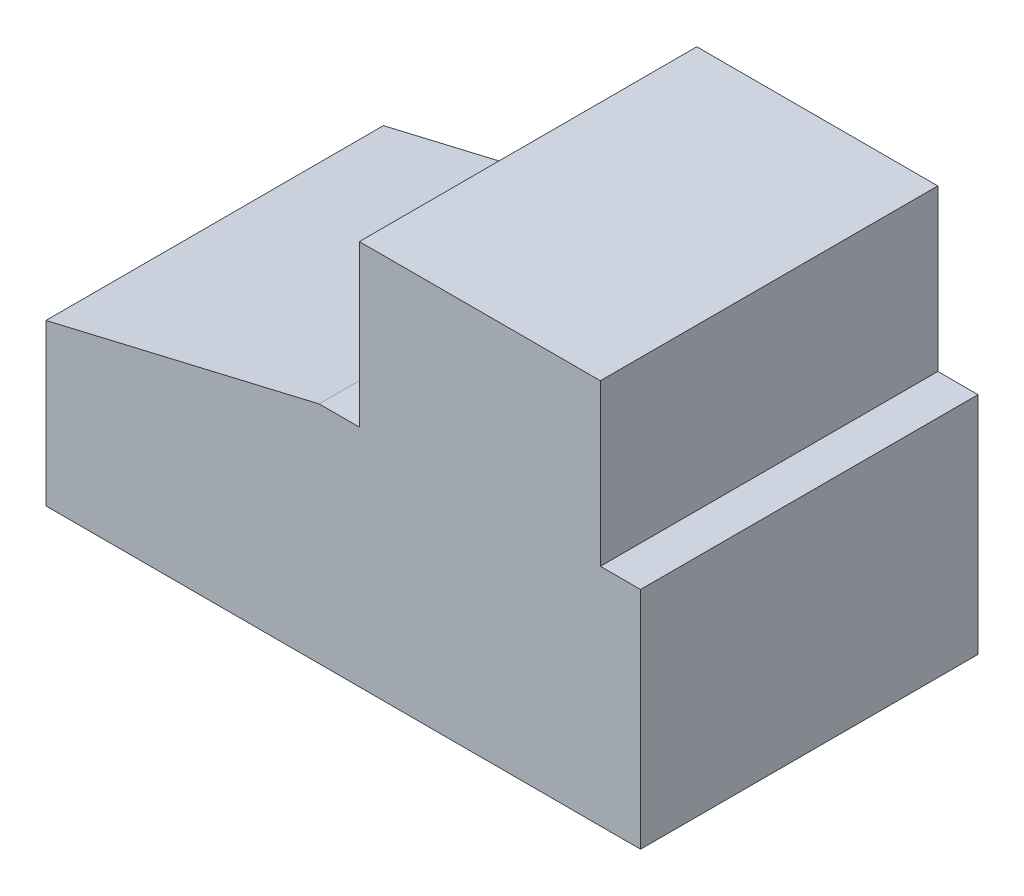
ISO-10303-21;
HEADER;
FILE_DESCRIPTION(('STEP AP214'),'2;1');
FILE_NAME('part.step','',(''),(''),'','','');
FILE_SCHEMA(('AUTOMOTIVE_DESIGN { 1 0 10303 214 1 1 1 1 }'));
ENDSEC;
DATA;
#1=APPLICATION_CONTEXT('core data for automotive mechanical design processes');
#2=APPLICATION_PROTOCOL_DEFINITION('international standard','automotive_design',2000,#1);
#3=PRODUCT_CONTEXT('',#1,'mechanical');
#4=PRODUCT('Part','Part','',(#3));
#5=PRODUCT_RELATED_PRODUCT_CATEGORY('part','',(#4));
#6=PRODUCT_DEFINITION_FORMATION('','',#4);
#7=PRODUCT_DEFINITION_CONTEXT('part definition',#1,'design');
#8=PRODUCT_DEFINITION('design','',#6,#7);
#9=PRODUCT_DEFINITION_SHAPE('','',#8);
#10=(LENGTH_UNIT() NAMED_UNIT(*) SI_UNIT(.MILLI.,.METRE.));
#11=(NAMED_UNIT(*) PLANE_ANGLE_UNIT() SI_UNIT($,.RADIAN.));
#12=(NAMED_UNIT(*) SI_UNIT($,.STERADIAN.) SOLID_ANGLE_UNIT());
#13=UNCERTAINTY_MEASURE_WITH_UNIT(LENGTH_MEASURE(1.E-05),#10,'distance_accuracy_value','');
#14=(GEOMETRIC_REPRESENTATION_CONTEXT(3) GLOBAL_UNCERTAINTY_ASSIGNED_CONTEXT((#13)) GLOBAL_UNIT_ASSIGNED_CONTEXT((#10,
#11,#12)) REPRESENTATION_CONTEXT('',''));
#15=CARTESIAN_POINT('',(0.,0.,0.));
#16=DIRECTION('',(0.,0.,1.));
#17=DIRECTION('',(1.,0.,0.));
#18=AXIS2_PLACEMENT_3D('',#15,#16,#17);
#19=CARTESIAN_POINT('',(0.,0.,42.));
#20=DIRECTION('',(1.,0.,0.));
#21=DIRECTION('',(0.,0.,-1.));
#22=AXIS2_PLACEMENT_3D('',#19,#20,#21);
#23=PLANE('',#22);
#24=DIRECTION('',(0.,-1.,0.));
#25=VECTOR('',#24,1.);
#26=CARTESIAN_POINT('',(0.,0.,0.));
#27=LINE('',#26,#25);
#28=CARTESIAN_POINT('',(0.,20.,0.));
#29=VERTEX_POINT('',#28);
#30=CARTESIAN_POINT('',(0.,0.,0.));
#31=VERTEX_POINT('',#30);
#32=EDGE_CURVE('E139',#29,#31,#27,.T.);
#33=ORIENTED_EDGE('',*,*,#32,.T.);
#34=DIRECTION('',(0.,0.,-1.));
#35=VECTOR('',#34,1.);
#36=CARTESIAN_POINT('',(0.,0.,42.));
#37=LINE('',#36,#35);
#38=CARTESIAN_POINT('',(0.,0.,42.));
#39=VERTEX_POINT('',#38);
#40=EDGE_CURVE('E11',#39,#31,#37,.T.);
#41=ORIENTED_EDGE('',*,*,#40,.F.);
#42=DIRECTION('',(0.,-1.,0.));
#43=VECTOR('',#42,1.);
#44=CARTESIAN_POINT('',(0.,0.,42.));
#45=LINE('',#44,#43);
#46=CARTESIAN_POINT('',(0.,20.,42.));
#47=VERTEX_POINT('',#46);
#48=EDGE_CURVE('E155',#47,#39,#45,.T.);
#49=ORIENTED_EDGE('',*,*,#48,.F.);
#50=DIRECTION('',(0.,0.,-1.));
#51=VECTOR('',#50,1.);
#52=CARTESIAN_POINT('',(0.,20.,42.));
#53=LINE('',#52,#51);
#54=EDGE_CURVE('E135',#47,#29,#53,.T.);
#55=ORIENTED_EDGE('',*,*,#54,.T.);
#56=EDGE_LOOP('',(#33,#41,#49,#55));
#57=FACE_BOUND('',#56,.T.);
#58=ADVANCED_FACE('F37',(#57),#23,.F.);
#59=CARTESIAN_POINT('',(0.,0.,42.));
#60=DIRECTION('',(0.,1.,0.));
#61=DIRECTION('',(0.,0.,1.));
#62=AXIS2_PLACEMENT_3D('',#59,#60,#61);
#63=PLANE('',#62);
#64=DIRECTION('',(1.,0.,0.));
#65=VECTOR('',#64,1.);
#66=CARTESIAN_POINT('',(0.,0.,0.));
#67=LINE('',#66,#65);
#68=CARTESIAN_POINT('',(74.,0.,0.));
#69=VERTEX_POINT('',#68);
#70=EDGE_CURVE('E142',#31,#69,#67,.T.);
#71=ORIENTED_EDGE('',*,*,#70,.T.);
#72=DIRECTION('',(0.,0.,-1.));
#73=VECTOR('',#72,1.);
#74=CARTESIAN_POINT('',(74.,0.,42.));
#75=LINE('',#74,#73);
#76=CARTESIAN_POINT('',(74.,0.,42.));
#77=VERTEX_POINT('',#76);
#78=EDGE_CURVE('E45',#77,#69,#75,.T.);
#79=ORIENTED_EDGE('',*,*,#78,.F.);
#80=DIRECTION('',(1.,0.,0.));
#81=VECTOR('',#80,1.);
#82=CARTESIAN_POINT('',(0.,0.,42.));
#83=LINE('',#82,#81);
#84=EDGE_CURVE('E99',#39,#77,#83,.T.);
#85=ORIENTED_EDGE('',*,*,#84,.F.);
#86=ORIENTED_EDGE('',*,*,#40,.T.);
#87=EDGE_LOOP('',(#71,#79,#85,#86));
#88=FACE_BOUND('',#87,.T.);
#89=ADVANCED_FACE('F198',(#88),#63,.F.);
#90=CARTESIAN_POINT('',(74.,0.,42.));
#91=DIRECTION('',(-1.,0.,0.));
#92=DIRECTION('',(0.,0.,1.));
#93=AXIS2_PLACEMENT_3D('',#90,#91,#92);
#94=PLANE('',#93);
#95=DIRECTION('',(0.,1.,0.));
#96=VECTOR('',#95,1.);
#97=CARTESIAN_POINT('',(74.,0.,0.));
#98=LINE('',#97,#96);
#99=CARTESIAN_POINT('',(74.,28.,0.));
#100=VERTEX_POINT('',#99);
#101=EDGE_CURVE('E144',#69,#100,#98,.T.);
#102=ORIENTED_EDGE('',*,*,#101,.T.);
#103=DIRECTION('',(0.,0.,-1.));
#104=VECTOR('',#103,1.);
#105=CARTESIAN_POINT('',(74.,28.,42.));
#106=LINE('',#105,#104);
#107=CARTESIAN_POINT('',(74.,28.,42.));
#108=VERTEX_POINT('',#107);
#109=EDGE_CURVE('E165',#108,#100,#106,.T.);
#110=ORIENTED_EDGE('',*,*,#109,.F.);
#111=DIRECTION('',(0.,1.,0.));
#112=VECTOR('',#111,1.);
#113=CARTESIAN_POINT('',(74.,0.,42.));
#114=LINE('',#113,#112);
#115=EDGE_CURVE('E173',#77,#108,#114,.T.);
#116=ORIENTED_EDGE('',*,*,#115,.F.);
#117=ORIENTED_EDGE('',*,*,#78,.T.);
#118=EDGE_LOOP('',(#102,#110,#116,#117));
#119=FACE_BOUND('',#118,.T.);
#120=ADVANCED_FACE('F171',(#119),#94,.F.);
#121=CARTESIAN_POINT('',(69.,28.,42.));
#122=DIRECTION('',(0.,-1.,0.));
#123=DIRECTION('',(0.,0.,-1.));
#124=AXIS2_PLACEMENT_3D('',#121,#122,#123);
#125=PLANE('',#124);
#126=DIRECTION('',(-1.,0.,0.));
#127=VECTOR('',#126,1.);
#128=CARTESIAN_POINT('',(69.,28.,0.));
#129=LINE('',#128,#127);
#130=CARTESIAN_POINT('',(69.,28.,0.));
#131=VERTEX_POINT('',#130);
#132=EDGE_CURVE('E146',#100,#131,#129,.T.);
#133=ORIENTED_EDGE('',*,*,#132,.T.);
#134=DIRECTION('',(0.,0.,-1.));
#135=VECTOR('',#134,1.);
#136=CARTESIAN_POINT('',(69.,28.,42.));
#137=LINE('',#136,#135);
#138=CARTESIAN_POINT('',(69.,28.,42.));
#139=VERTEX_POINT('',#138);
#140=EDGE_CURVE('E162',#139,#131,#137,.T.);
#141=ORIENTED_EDGE('',*,*,#140,.F.);
#142=DIRECTION('',(-1.,0.,0.));
#143=VECTOR('',#142,1.);
#144=CARTESIAN_POINT('',(69.,28.,42.));
#145=LINE('',#144,#143);
#146=EDGE_CURVE('E189',#108,#139,#145,.T.);
#147=ORIENTED_EDGE('',*,*,#146,.F.);
#148=ORIENTED_EDGE('',*,*,#109,.T.);
#149=EDGE_LOOP('',(#133,#141,#147,#148));
#150=FACE_BOUND('',#149,.T.);
#151=ADVANCED_FACE('F182',(#150),#125,.F.);
#152=CARTESIAN_POINT('',(69.,48.,42.));
#153=DIRECTION('',(-1.,0.,0.));
#154=DIRECTION('',(0.,0.,1.));
#155=AXIS2_PLACEMENT_3D('',#152,#153,#154);
#156=PLANE('',#155);
#157=DIRECTION('',(0.,1.,0.));
#158=VECTOR('',#157,1.);
#159=CARTESIAN_POINT('',(69.,48.,0.));
#160=LINE('',#159,#158);
#161=CARTESIAN_POINT('',(69.,48.,0.));
#162=VERTEX_POINT('',#161);
#163=EDGE_CURVE('E148',#131,#162,#160,.T.);
#164=ORIENTED_EDGE('',*,*,#163,.T.);
#165=DIRECTION('',(0.,0.,-1.));
#166=VECTOR('',#165,1.);
#167=CARTESIAN_POINT('',(69.,48.,42.));
#168=LINE('',#167,#166);
#169=CARTESIAN_POINT('',(69.,48.,42.));
#170=VERTEX_POINT('',#169);
#171=EDGE_CURVE('E159',#170,#162,#168,.T.);
#172=ORIENTED_EDGE('',*,*,#171,.F.);
#173=DIRECTION('',(0.,1.,0.));
#174=VECTOR('',#173,1.);
#175=CARTESIAN_POINT('',(69.,48.,42.));
#176=LINE('',#175,#174);
#177=EDGE_CURVE('E188',#139,#170,#176,.T.);
#178=ORIENTED_EDGE('',*,*,#177,.F.);
#179=ORIENTED_EDGE('',*,*,#140,.T.);
#180=EDGE_LOOP('',(#164,#172,#178,#179));
#181=FACE_BOUND('',#180,.T.);
#182=ADVANCED_FACE('F186',(#181),#156,.F.);
#183=CARTESIAN_POINT('',(39.,48.,42.));
#184=DIRECTION('',(0.,-1.,0.));
#185=DIRECTION('',(0.,0.,-1.));
#186=AXIS2_PLACEMENT_3D('',#183,#184,#185);
#187=PLANE('',#186);
#188=DIRECTION('',(-1.,0.,0.));
#189=VECTOR('',#188,1.);
#190=CARTESIAN_POINT('',(39.,48.,0.));
#191=LINE('',#190,#189);
#192=CARTESIAN_POINT('',(39.,48.,0.));
#193=VERTEX_POINT('',#192);
#194=EDGE_CURVE('E150',#162,#193,#191,.T.);
#195=ORIENTED_EDGE('',*,*,#194,.T.);
#196=DIRECTION('',(0.,0.,-1.));
#197=VECTOR('',#196,1.);
#198=CARTESIAN_POINT('',(39.,48.,42.));
#199=LINE('',#198,#197);
#200=CARTESIAN_POINT('',(39.,48.,42.));
#201=VERTEX_POINT('',#200);
#202=EDGE_CURVE('E130',#201,#193,#199,.T.);
#203=ORIENTED_EDGE('',*,*,#202,.F.);
#204=DIRECTION('',(-1.,0.,0.));
#205=VECTOR('',#204,1.);
#206=CARTESIAN_POINT('',(39.,48.,42.));
#207=LINE('',#206,#205);
#208=EDGE_CURVE('E121',#170,#201,#207,.T.);
#209=ORIENTED_EDGE('',*,*,#208,.F.);
#210=ORIENTED_EDGE('',*,*,#171,.T.);
#211=EDGE_LOOP('',(#195,#203,#209,#210));
#212=FACE_BOUND('',#211,.T.);
#213=ADVANCED_FACE('F210',(#212),#187,.F.);
#214=CARTESIAN_POINT('',(39.,48.,42.));
#215=DIRECTION('',(1.,0.,0.));
#216=DIRECTION('',(0.,0.,-1.));
#217=AXIS2_PLACEMENT_3D('',#214,#215,#216);
#218=PLANE('',#217);
#219=DIRECTION('',(0.,-1.,0.));
#220=VECTOR('',#219,1.);
#221=CARTESIAN_POINT('',(39.,48.,0.));
#222=LINE('',#221,#220);
#223=CARTESIAN_POINT('',(39.,28.,0.));
#224=VERTEX_POINT('',#223);
#225=EDGE_CURVE('E129',#193,#224,#222,.T.);
#226=ORIENTED_EDGE('',*,*,#225,.T.);
#227=DIRECTION('',(0.,0.,-1.));
#228=VECTOR('',#227,1.);
#229=CARTESIAN_POINT('',(39.,28.,42.));
#230=LINE('',#229,#228);
#231=CARTESIAN_POINT('',(39.,28.,42.));
#232=VERTEX_POINT('',#231);
#233=EDGE_CURVE('E126',#232,#224,#230,.T.);
#234=ORIENTED_EDGE('',*,*,#233,.F.);
#235=DIRECTION('',(0.,-1.,0.));
#236=VECTOR('',#235,1.);
#237=CARTESIAN_POINT('',(39.,48.,42.));
#238=LINE('',#237,#236);
#239=EDGE_CURVE('E115',#201,#232,#238,.T.);
#240=ORIENTED_EDGE('',*,*,#239,.F.);
#241=ORIENTED_EDGE('',*,*,#202,.T.);
#242=EDGE_LOOP('',(#226,#234,#240,#241));
#243=FACE_BOUND('',#242,.T.);
#244=ADVANCED_FACE('F127',(#243),#218,.F.);
#245=CARTESIAN_POINT('',(34.,28.,42.));
#246=DIRECTION('',(0.,-1.,0.));
#247=DIRECTION('',(0.,0.,-1.));
#248=AXIS2_PLACEMENT_3D('',#245,#246,#247);
#249=PLANE('',#248);
#250=DIRECTION('',(-1.,0.,0.));
#251=VECTOR('',#250,1.);
#252=CARTESIAN_POINT('',(34.,28.,0.));
#253=LINE('',#252,#251);
#254=CARTESIAN_POINT('',(34.,28.,0.));
#255=VERTEX_POINT('',#254);
#256=EDGE_CURVE('E85',#224,#255,#253,.T.);
#257=ORIENTED_EDGE('',*,*,#256,.T.);
#258=DIRECTION('',(0.,0.,-1.));
#259=VECTOR('',#258,1.);
#260=CARTESIAN_POINT('',(34.,28.,42.));
#261=LINE('',#260,#259);
#262=CARTESIAN_POINT('',(34.,28.,42.));
#263=VERTEX_POINT('',#262);
#264=EDGE_CURVE('E131',#263,#255,#261,.T.);
#265=ORIENTED_EDGE('',*,*,#264,.F.);
#266=DIRECTION('',(-1.,0.,0.));
#267=VECTOR('',#266,1.);
#268=CARTESIAN_POINT('',(34.,28.,42.));
#269=LINE('',#268,#267);
#270=EDGE_CURVE('E119',#232,#263,#269,.T.);
#271=ORIENTED_EDGE('',*,*,#270,.F.);
#272=ORIENTED_EDGE('',*,*,#233,.T.);
#273=EDGE_LOOP('',(#257,#265,#271,#272));
#274=FACE_BOUND('',#273,.T.);
#275=ADVANCED_FACE('F133',(#274),#249,.F.);
#276=CARTESIAN_POINT('',(0.,20.,42.));
#277=DIRECTION('',(0.229039333725547,-0.973417168333576,0.));
#278=DIRECTION('',(0.973417168333576,0.229039333725547,0.));
#279=AXIS2_PLACEMENT_3D('',#276,#277,#278);
#280=PLANE('',#279);
#281=DIRECTION('',(-0.973417168333576,-0.229039333725547,0.));
#282=VECTOR('',#281,1.);
#283=CARTESIAN_POINT('',(0.,20.,0.));
#284=LINE('',#283,#282);
#285=EDGE_CURVE('E91',#255,#29,#284,.T.);
#286=ORIENTED_EDGE('',*,*,#285,.T.);
#287=ORIENTED_EDGE('',*,*,#54,.F.);
#288=DIRECTION('',(-0.973417168333576,-0.229039333725547,0.));
#289=VECTOR('',#288,1.);
#290=CARTESIAN_POINT('',(0.,20.,42.));
#291=LINE('',#290,#289);
#292=EDGE_CURVE('E53',#263,#47,#291,.T.);
#293=ORIENTED_EDGE('',*,*,#292,.F.);
#294=ORIENTED_EDGE('',*,*,#264,.T.);
#295=EDGE_LOOP('',(#286,#287,#293,#294));
#296=FACE_BOUND('',#295,.T.);
#297=ADVANCED_FACE('F218',(#296),#280,.F.);
#298=CARTESIAN_POINT('',(0.,0.,42.));
#299=DIRECTION('',(0.,0.,-1.));
#300=DIRECTION('',(-1.,0.,0.));
#301=AXIS2_PLACEMENT_3D('',#298,#299,#300);
#302=PLANE('',#301);
#303=ORIENTED_EDGE('',*,*,#48,.T.);
#304=ORIENTED_EDGE('',*,*,#84,.T.);
#305=ORIENTED_EDGE('',*,*,#115,.T.);
#306=ORIENTED_EDGE('',*,*,#146,.T.);
#307=ORIENTED_EDGE('',*,*,#177,.T.);
#308=ORIENTED_EDGE('',*,*,#208,.T.);
#309=ORIENTED_EDGE('',*,*,#239,.T.);
#310=ORIENTED_EDGE('',*,*,#270,.T.);
#311=ORIENTED_EDGE('',*,*,#292,.T.);
#312=EDGE_LOOP('',(#303,#304,#305,#306,#307,#308,#309,#310,#311));
#313=FACE_BOUND('',#312,.T.);
#314=ADVANCED_FACE('F117',(#313),#302,.F.);
#315=CARTESIAN_POINT('',(0.,0.,0.));
#316=DIRECTION('',(0.,0.,-1.));
#317=DIRECTION('',(-1.,0.,0.));
#318=AXIS2_PLACEMENT_3D('',#315,#316,#317);
#319=PLANE('',#318);
#320=ORIENTED_EDGE('',*,*,#32,.F.);
#321=ORIENTED_EDGE('',*,*,#285,.F.);
#322=ORIENTED_EDGE('',*,*,#256,.F.);
#323=ORIENTED_EDGE('',*,*,#225,.F.);
#324=ORIENTED_EDGE('',*,*,#194,.F.);
#325=ORIENTED_EDGE('',*,*,#163,.F.);
#326=ORIENTED_EDGE('',*,*,#132,.F.);
#327=ORIENTED_EDGE('',*,*,#101,.F.);
#328=ORIENTED_EDGE('',*,*,#70,.F.);
#329=EDGE_LOOP('',(#320,#321,#322,#323,#324,#325,#326,#327,#328));
#330=FACE_BOUND('',#329,.T.);
#331=ADVANCED_FACE('F177',(#330),#319,.T.);
#332=CLOSED_SHELL('',(#58,#89,#120,#151,#182,#213,#244,#275,#297,#314,#331));
#333=MANIFOLD_SOLID_BREP('B2',#332);
#334=ADVANCED_BREP_SHAPE_REPRESENTATION('',(#18,#333),#14);
#335=SHAPE_DEFINITION_REPRESENTATION(#9,#334);
ENDSEC;
END-ISO-10303-21;
